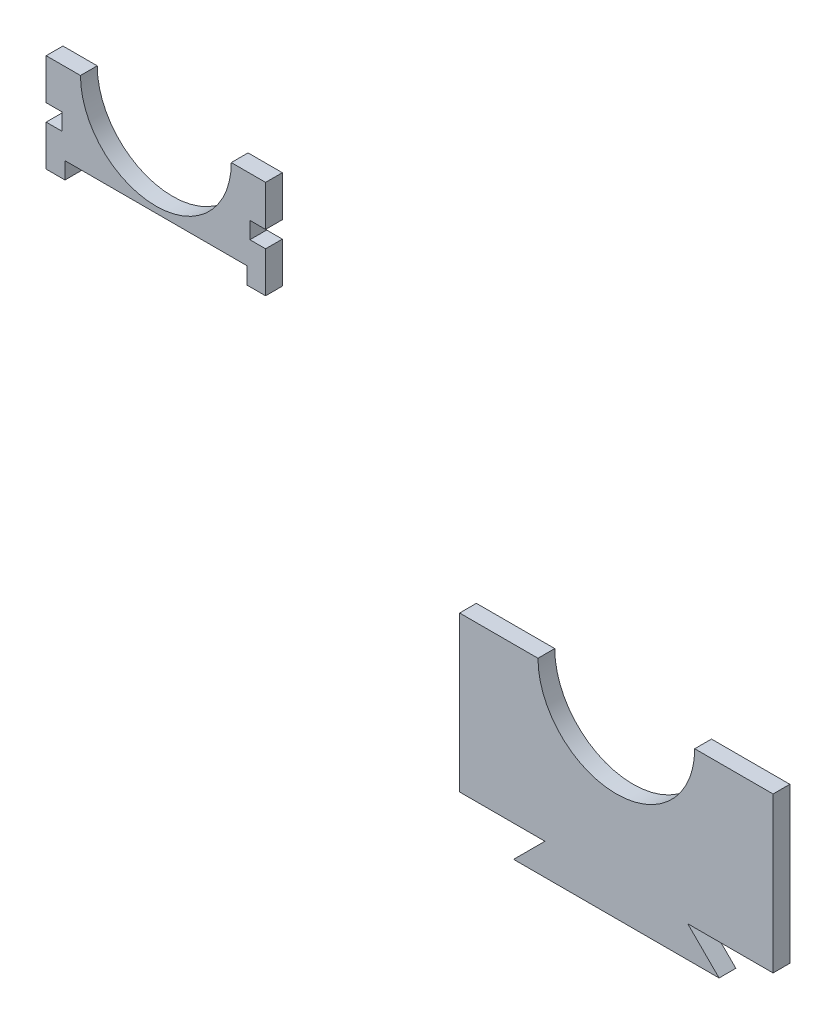
ISO-10303-21;
HEADER;
FILE_DESCRIPTION(('STEP AP214'),'2;1');
FILE_NAME('part.step','',(''),(''),'','','');
FILE_SCHEMA(('AUTOMOTIVE_DESIGN { 1 0 10303 214 1 1 1 1 }'));
ENDSEC;
DATA;
#1=APPLICATION_CONTEXT('core data for automotive mechanical design processes');
#2=APPLICATION_PROTOCOL_DEFINITION('international standard','automotive_design',2000,#1);
#3=PRODUCT_CONTEXT('',#1,'mechanical');
#4=PRODUCT('Part','Part','',(#3));
#5=PRODUCT_RELATED_PRODUCT_CATEGORY('part','',(#4));
#6=PRODUCT_DEFINITION_FORMATION('','',#4);
#7=PRODUCT_DEFINITION_CONTEXT('part definition',#1,'design');
#8=PRODUCT_DEFINITION('design','',#6,#7);
#9=PRODUCT_DEFINITION_SHAPE('','',#8);
#10=(LENGTH_UNIT() NAMED_UNIT(*) SI_UNIT(.MILLI.,.METRE.));
#11=(NAMED_UNIT(*) PLANE_ANGLE_UNIT() SI_UNIT($,.RADIAN.));
#12=(NAMED_UNIT(*) SI_UNIT($,.STERADIAN.) SOLID_ANGLE_UNIT());
#13=UNCERTAINTY_MEASURE_WITH_UNIT(LENGTH_MEASURE(1.E-05),#10,'distance_accuracy_value','');
#14=(GEOMETRIC_REPRESENTATION_CONTEXT(3) GLOBAL_UNCERTAINTY_ASSIGNED_CONTEXT((#13)) GLOBAL_UNIT_ASSIGNED_CONTEXT((#10,
#11,#12)) REPRESENTATION_CONTEXT('',''));
#15=CARTESIAN_POINT('',(0.,0.,0.));
#16=DIRECTION('',(0.,0.,1.));
#17=DIRECTION('',(1.,0.,0.));
#18=AXIS2_PLACEMENT_3D('',#15,#16,#17);
#19=CARTESIAN_POINT('',(114.119509818811,-121.477215278298,5.35));
#20=DIRECTION('',(0.707106781186551,-0.707106781186544,0.));
#21=DIRECTION('',(0.707106781186544,0.707106781186551,0.));
#22=AXIS2_PLACEMENT_3D('',#19,#20,#21);
#23=PLANE('',#22);
#24=DIRECTION('',(-0.707106781186544,-0.707106781186551,0.));
#25=VECTOR('',#24,1.);
#26=CARTESIAN_POINT('',(114.119509818811,-121.477215278298,0.));
#27=LINE('',#26,#25);
#28=CARTESIAN_POINT('',(124.119509818811,-111.477215278298,0.));
#29=VERTEX_POINT('',#28);
#30=CARTESIAN_POINT('',(114.119509818811,-121.477215278298,0.));
#31=VERTEX_POINT('',#30);
#32=EDGE_CURVE('E151',#29,#31,#27,.T.);
#33=ORIENTED_EDGE('',*,*,#32,.T.);
#34=DIRECTION('',(0.,0.,-1.));
#35=VECTOR('',#34,1.);
#36=CARTESIAN_POINT('',(114.119509818811,-121.477215278298,5.35));
#37=LINE('',#36,#35);
#38=CARTESIAN_POINT('',(114.119509818811,-121.477215278298,5.35));
#39=VERTEX_POINT('',#38);
#40=EDGE_CURVE('E12',#39,#31,#37,.T.);
#41=ORIENTED_EDGE('',*,*,#40,.F.);
#42=DIRECTION('',(-0.707106781186544,-0.707106781186551,0.));
#43=VECTOR('',#42,1.);
#44=CARTESIAN_POINT('',(114.119509818811,-121.477215278298,5.35));
#45=LINE('',#44,#43);
#46=CARTESIAN_POINT('',(124.119509818811,-111.477215278298,5.35));
#47=VERTEX_POINT('',#46);
#48=EDGE_CURVE('E169',#47,#39,#45,.T.);
#49=ORIENTED_EDGE('',*,*,#48,.F.);
#50=DIRECTION('',(0.,0.,-1.));
#51=VECTOR('',#50,1.);
#52=CARTESIAN_POINT('',(124.119509818811,-111.477215278298,5.35));
#53=LINE('',#52,#51);
#54=EDGE_CURVE('E147',#47,#29,#53,.T.);
#55=ORIENTED_EDGE('',*,*,#54,.T.);
#56=EDGE_LOOP('',(#33,#41,#49,#55));
#57=FACE_BOUND('',#56,.T.);
#58=ADVANCED_FACE('F43',(#57),#23,.F.);
#59=CARTESIAN_POINT('',(114.119509818811,-121.477215278298,5.35));
#60=DIRECTION('',(0.,1.,0.));
#61=DIRECTION('',(0.,0.,1.));
#62=AXIS2_PLACEMENT_3D('',#59,#60,#61);
#63=PLANE('',#62);
#64=DIRECTION('',(1.,0.,0.));
#65=VECTOR('',#64,1.);
#66=CARTESIAN_POINT('',(114.119509818811,-121.477215278298,0.));
#67=LINE('',#66,#65);
#68=CARTESIAN_POINT('',(179.674785827473,-121.477215278298,0.));
#69=VERTEX_POINT('',#68);
#70=EDGE_CURVE('E154',#31,#69,#67,.T.);
#71=ORIENTED_EDGE('',*,*,#70,.T.);
#72=DIRECTION('',(0.,0.,-1.));
#73=VECTOR('',#72,1.);
#74=CARTESIAN_POINT('',(179.674785827473,-121.477215278298,5.35));
#75=LINE('',#74,#73);
#76=CARTESIAN_POINT('',(179.674785827473,-121.477215278298,5.35));
#77=VERTEX_POINT('',#76);
#78=EDGE_CURVE('E51',#77,#69,#75,.T.);
#79=ORIENTED_EDGE('',*,*,#78,.F.);
#80=DIRECTION('',(1.,0.,0.));
#81=VECTOR('',#80,1.);
#82=CARTESIAN_POINT('',(114.119509818811,-121.477215278298,5.35));
#83=LINE('',#82,#81);
#84=EDGE_CURVE('E108',#39,#77,#83,.T.);
#85=ORIENTED_EDGE('',*,*,#84,.F.);
#86=ORIENTED_EDGE('',*,*,#40,.T.);
#87=EDGE_LOOP('',(#71,#79,#85,#86));
#88=FACE_BOUND('',#87,.T.);
#89=ADVANCED_FACE('F218',(#88),#63,.F.);
#90=CARTESIAN_POINT('',(179.674785827473,-121.477215278298,5.35));
#91=DIRECTION('',(-0.707106781186549,-0.707106781186546,0.));
#92=DIRECTION('',(0.707106781186546,-0.707106781186549,0.));
#93=AXIS2_PLACEMENT_3D('',#90,#91,#92);
#94=PLANE('',#93);
#95=DIRECTION('',(-0.707106781186546,0.707106781186549,0.));
#96=VECTOR('',#95,1.);
#97=CARTESIAN_POINT('',(179.674785827473,-121.477215278298,0.));
#98=LINE('',#97,#96);
#99=CARTESIAN_POINT('',(169.674785827473,-111.477215278298,0.));
#100=VERTEX_POINT('',#99);
#101=EDGE_CURVE('E156',#69,#100,#98,.T.);
#102=ORIENTED_EDGE('',*,*,#101,.T.);
#103=DIRECTION('',(0.,0.,-1.));
#104=VECTOR('',#103,1.);
#105=CARTESIAN_POINT('',(169.674785827473,-111.477215278298,5.35));
#106=LINE('',#105,#104);
#107=CARTESIAN_POINT('',(169.674785827473,-111.477215278298,5.35));
#108=VERTEX_POINT('',#107);
#109=EDGE_CURVE('E182',#108,#100,#106,.T.);
#110=ORIENTED_EDGE('',*,*,#109,.F.);
#111=DIRECTION('',(-0.707106781186546,0.707106781186549,0.));
#112=VECTOR('',#111,1.);
#113=CARTESIAN_POINT('',(179.674785827473,-121.477215278298,5.35));
#114=LINE('',#113,#112);
#115=EDGE_CURVE('E190',#77,#108,#114,.T.);
#116=ORIENTED_EDGE('',*,*,#115,.F.);
#117=ORIENTED_EDGE('',*,*,#78,.T.);
#118=EDGE_LOOP('',(#102,#110,#116,#117));
#119=FACE_BOUND('',#118,.T.);
#120=ADVANCED_FACE('F188',(#119),#94,.F.);
#121=CARTESIAN_POINT('',(169.674785827473,-111.477215278298,5.35));
#122=DIRECTION('',(0.,1.,0.));
#123=DIRECTION('',(0.,0.,1.));
#124=AXIS2_PLACEMENT_3D('',#121,#122,#123);
#125=PLANE('',#124);
#126=DIRECTION('',(1.,0.,0.));
#127=VECTOR('',#126,1.);
#128=CARTESIAN_POINT('',(169.674785827473,-111.477215278298,0.));
#129=LINE('',#128,#127);
#130=CARTESIAN_POINT('',(196.897147823142,-111.477215278298,0.));
#131=VERTEX_POINT('',#130);
#132=EDGE_CURVE('E158',#100,#131,#129,.T.);
#133=ORIENTED_EDGE('',*,*,#132,.T.);
#134=DIRECTION('',(0.,0.,-1.));
#135=VECTOR('',#134,1.);
#136=CARTESIAN_POINT('',(196.897147823142,-111.477215278298,5.35));
#137=LINE('',#136,#135);
#138=CARTESIAN_POINT('',(196.897147823142,-111.477215278298,5.35));
#139=VERTEX_POINT('',#138);
#140=EDGE_CURVE('E179',#139,#131,#137,.T.);
#141=ORIENTED_EDGE('',*,*,#140,.F.);
#142=DIRECTION('',(1.,0.,0.));
#143=VECTOR('',#142,1.);
#144=CARTESIAN_POINT('',(169.674785827473,-111.477215278298,5.35));
#145=LINE('',#144,#143);
#146=EDGE_CURVE('E208',#108,#139,#145,.T.);
#147=ORIENTED_EDGE('',*,*,#146,.F.);
#148=ORIENTED_EDGE('',*,*,#109,.T.);
#149=EDGE_LOOP('',(#133,#141,#147,#148));
#150=FACE_BOUND('',#149,.T.);
#151=ADVANCED_FACE('F199',(#150),#125,.F.);
#152=CARTESIAN_POINT('',(196.897147823142,-111.477215278298,5.35));
#153=DIRECTION('',(-1.,0.,0.));
#154=DIRECTION('',(0.,0.,1.));
#155=AXIS2_PLACEMENT_3D('',#152,#153,#154);
#156=PLANE('',#155);
#157=DIRECTION('',(0.,1.,0.));
#158=VECTOR('',#157,1.);
#159=CARTESIAN_POINT('',(196.897147823142,-111.477215278298,0.));
#160=LINE('',#159,#158);
#161=CARTESIAN_POINT('',(196.897147823142,-62.0226927100301,0.));
#162=VERTEX_POINT('',#161);
#163=EDGE_CURVE('E160',#131,#162,#160,.T.);
#164=ORIENTED_EDGE('',*,*,#163,.T.);
#165=DIRECTION('',(0.,0.,-1.));
#166=VECTOR('',#165,1.);
#167=CARTESIAN_POINT('',(196.897147823142,-62.0226927100301,5.35));
#168=LINE('',#167,#166);
#169=CARTESIAN_POINT('',(196.897147823142,-62.0226927100301,5.35));
#170=VERTEX_POINT('',#169);
#171=EDGE_CURVE('E176',#170,#162,#168,.T.);
#172=ORIENTED_EDGE('',*,*,#171,.F.);
#173=DIRECTION('',(0.,1.,0.));
#174=VECTOR('',#173,1.);
#175=CARTESIAN_POINT('',(196.897147823142,-111.477215278298,5.35));
#176=LINE('',#175,#174);
#177=EDGE_CURVE('E205',#139,#170,#176,.T.);
#178=ORIENTED_EDGE('',*,*,#177,.F.);
#179=ORIENTED_EDGE('',*,*,#140,.T.);
#180=EDGE_LOOP('',(#164,#172,#178,#179));
#181=FACE_BOUND('',#180,.T.);
#182=ADVANCED_FACE('F203',(#181),#156,.F.);
#183=CARTESIAN_POINT('',(171.897147823142,-62.0226927100301,5.35));
#184=DIRECTION('',(0.,-1.,0.));
#185=DIRECTION('',(0.,0.,-1.));
#186=AXIS2_PLACEMENT_3D('',#183,#184,#185);
#187=PLANE('',#186);
#188=DIRECTION('',(-1.,0.,0.));
#189=VECTOR('',#188,1.);
#190=CARTESIAN_POINT('',(171.897147823142,-62.0226927100301,0.));
#191=LINE('',#190,#189);
#192=CARTESIAN_POINT('',(171.897147823142,-62.0226927100301,0.));
#193=VERTEX_POINT('',#192);
#194=EDGE_CURVE('E162',#162,#193,#191,.T.);
#195=ORIENTED_EDGE('',*,*,#194,.T.);
#196=DIRECTION('',(0.,0.,-1.));
#197=VECTOR('',#196,1.);
#198=CARTESIAN_POINT('',(171.897147823142,-62.0226927100301,5.35));
#199=LINE('',#198,#197);
#200=CARTESIAN_POINT('',(171.897147823142,-62.0226927100301,5.35));
#201=VERTEX_POINT('',#200);
#202=EDGE_CURVE('E173',#201,#193,#199,.T.);
#203=ORIENTED_EDGE('',*,*,#202,.F.);
#204=DIRECTION('',(-1.,0.,0.));
#205=VECTOR('',#204,1.);
#206=CARTESIAN_POINT('',(171.897147823142,-62.0226927100301,5.35));
#207=LINE('',#206,#205);
#208=EDGE_CURVE('E207',#170,#201,#207,.T.);
#209=ORIENTED_EDGE('',*,*,#208,.F.);
#210=ORIENTED_EDGE('',*,*,#171,.T.);
#211=EDGE_LOOP('',(#195,#203,#209,#210));
#212=FACE_BOUND('',#211,.T.);
#213=ADVANCED_FACE('F230',(#212),#187,.F.);
#214=CARTESIAN_POINT('',(146.897147823142,-62.0226927100301,5.35));
#215=DIRECTION('',(0.,0.,-1.));
#216=DIRECTION('',(-1.,0.,0.));
#217=AXIS2_PLACEMENT_3D('',#214,#215,#216);
#218=CYLINDRICAL_SURFACE('',#217,25.);
#219=CARTESIAN_POINT('',(146.897147823142,-62.0226927100301,0.));
#220=DIRECTION('',(0.,0.,-1.));
#221=DIRECTION('',(1.,0.,0.));
#222=AXIS2_PLACEMENT_3D('',#219,#220,#221);
#223=CIRCLE('',#222,25.);
#224=CARTESIAN_POINT('',(121.897147823142,-62.0226927100301,0.));
#225=VERTEX_POINT('',#224);
#226=EDGE_CURVE('E164',#193,#225,#223,.T.);
#227=ORIENTED_EDGE('',*,*,#226,.T.);
#228=DIRECTION('',(0.,0.,-1.));
#229=VECTOR('',#228,1.);
#230=CARTESIAN_POINT('',(121.897147823142,-62.0226927100301,5.35));
#231=LINE('',#230,#229);
#232=CARTESIAN_POINT('',(121.897147823142,-62.0226927100301,5.35));
#233=VERTEX_POINT('',#232);
#234=EDGE_CURVE('E142',#233,#225,#231,.T.);
#235=ORIENTED_EDGE('',*,*,#234,.F.);
#236=CARTESIAN_POINT('',(146.897147823142,-62.0226927100301,5.35));
#237=DIRECTION('',(0.,0.,-1.));
#238=DIRECTION('',(1.,0.,0.));
#239=AXIS2_PLACEMENT_3D('',#236,#237,#238);
#240=CIRCLE('',#239,25.);
#241=EDGE_CURVE('E133',#201,#233,#240,.T.);
#242=ORIENTED_EDGE('',*,*,#241,.F.);
#243=ORIENTED_EDGE('',*,*,#202,.T.);
#244=EDGE_LOOP('',(#227,#235,#242,#243));
#245=FACE_BOUND('',#244,.T.);
#246=ADVANCED_FACE('F233',(#245),#218,.F.);
#247=CARTESIAN_POINT('',(96.897147823142,-62.0226927100301,5.35));
#248=DIRECTION('',(0.,-1.,0.));
#249=DIRECTION('',(0.,0.,-1.));
#250=AXIS2_PLACEMENT_3D('',#247,#248,#249);
#251=PLANE('',#250);
#252=DIRECTION('',(-1.,0.,0.));
#253=VECTOR('',#252,1.);
#254=CARTESIAN_POINT('',(96.897147823142,-62.0226927100301,0.));
#255=LINE('',#254,#253);
#256=CARTESIAN_POINT('',(96.897147823142,-62.0226927100301,0.));
#257=VERTEX_POINT('',#256);
#258=EDGE_CURVE('E141',#225,#257,#255,.T.);
#259=ORIENTED_EDGE('',*,*,#258,.T.);
#260=DIRECTION('',(0.,0.,-1.));
#261=VECTOR('',#260,1.);
#262=CARTESIAN_POINT('',(96.897147823142,-62.0226927100301,5.35));
#263=LINE('',#262,#261);
#264=CARTESIAN_POINT('',(96.897147823142,-62.0226927100301,5.35));
#265=VERTEX_POINT('',#264);
#266=EDGE_CURVE('E138',#265,#257,#263,.T.);
#267=ORIENTED_EDGE('',*,*,#266,.F.);
#268=DIRECTION('',(-1.,0.,0.));
#269=VECTOR('',#268,1.);
#270=CARTESIAN_POINT('',(96.897147823142,-62.0226927100301,5.35));
#271=LINE('',#270,#269);
#272=EDGE_CURVE('E127',#233,#265,#271,.T.);
#273=ORIENTED_EDGE('',*,*,#272,.F.);
#274=ORIENTED_EDGE('',*,*,#234,.T.);
#275=EDGE_LOOP('',(#259,#267,#273,#274));
#276=FACE_BOUND('',#275,.T.);
#277=ADVANCED_FACE('F139',(#276),#251,.F.);
#278=CARTESIAN_POINT('',(96.897147823142,-111.477215278298,5.35));
#279=DIRECTION('',(1.,0.,0.));
#280=DIRECTION('',(0.,0.,-1.));
#281=AXIS2_PLACEMENT_3D('',#278,#279,#280);
#282=PLANE('',#281);
#283=DIRECTION('',(0.,-1.,0.));
#284=VECTOR('',#283,1.);
#285=CARTESIAN_POINT('',(96.897147823142,-111.477215278298,0.));
#286=LINE('',#285,#284);
#287=CARTESIAN_POINT('',(96.897147823142,-111.477215278298,0.));
#288=VERTEX_POINT('',#287);
#289=EDGE_CURVE('E94',#257,#288,#286,.T.);
#290=ORIENTED_EDGE('',*,*,#289,.T.);
#291=DIRECTION('',(0.,0.,-1.));
#292=VECTOR('',#291,1.);
#293=CARTESIAN_POINT('',(96.897147823142,-111.477215278298,5.35));
#294=LINE('',#293,#292);
#295=CARTESIAN_POINT('',(96.897147823142,-111.477215278298,5.35));
#296=VERTEX_POINT('',#295);
#297=EDGE_CURVE('E143',#296,#288,#294,.T.);
#298=ORIENTED_EDGE('',*,*,#297,.F.);
#299=DIRECTION('',(0.,-1.,0.));
#300=VECTOR('',#299,1.);
#301=CARTESIAN_POINT('',(96.897147823142,-111.477215278298,5.35));
#302=LINE('',#301,#300);
#303=EDGE_CURVE('E131',#265,#296,#302,.T.);
#304=ORIENTED_EDGE('',*,*,#303,.F.);
#305=ORIENTED_EDGE('',*,*,#266,.T.);
#306=EDGE_LOOP('',(#290,#298,#304,#305));
#307=FACE_BOUND('',#306,.T.);
#308=ADVANCED_FACE('F145',(#307),#282,.F.);
#309=CARTESIAN_POINT('',(96.897147823142,-111.477215278298,5.35));
#310=DIRECTION('',(0.,1.,0.));
#311=DIRECTION('',(0.,0.,1.));
#312=AXIS2_PLACEMENT_3D('',#309,#310,#311);
#313=PLANE('',#312);
#314=DIRECTION('',(1.,0.,0.));
#315=VECTOR('',#314,1.);
#316=CARTESIAN_POINT('',(96.897147823142,-111.477215278298,0.));
#317=LINE('',#316,#315);
#318=EDGE_CURVE('E100',#288,#29,#317,.T.);
#319=ORIENTED_EDGE('',*,*,#318,.T.);
#320=ORIENTED_EDGE('',*,*,#54,.F.);
#321=DIRECTION('',(1.,0.,0.));
#322=VECTOR('',#321,1.);
#323=CARTESIAN_POINT('',(96.897147823142,-111.477215278298,5.35));
#324=LINE('',#323,#322);
#325=EDGE_CURVE('E59',#296,#47,#324,.T.);
#326=ORIENTED_EDGE('',*,*,#325,.F.);
#327=ORIENTED_EDGE('',*,*,#297,.T.);
#328=EDGE_LOOP('',(#319,#320,#326,#327));
#329=FACE_BOUND('',#328,.T.);
#330=ADVANCED_FACE('F242',(#329),#313,.F.);
#331=CARTESIAN_POINT('',(146.897147823142,-62.0226927100301,5.35));
#332=DIRECTION('',(0.,0.,1.));
#333=DIRECTION('',(1.,0.,0.));
#334=AXIS2_PLACEMENT_3D('',#331,#332,#333);
#335=PLANE('',#334);
#336=ORIENTED_EDGE('',*,*,#48,.T.);
#337=ORIENTED_EDGE('',*,*,#84,.T.);
#338=ORIENTED_EDGE('',*,*,#115,.T.);
#339=ORIENTED_EDGE('',*,*,#146,.T.);
#340=ORIENTED_EDGE('',*,*,#177,.T.);
#341=ORIENTED_EDGE('',*,*,#208,.T.);
#342=ORIENTED_EDGE('',*,*,#241,.T.);
#343=ORIENTED_EDGE('',*,*,#272,.T.);
#344=ORIENTED_EDGE('',*,*,#303,.T.);
#345=ORIENTED_EDGE('',*,*,#325,.T.);
#346=EDGE_LOOP('',(#336,#337,#338,#339,#340,#341,#342,#343,#344,#345));
#347=FACE_BOUND('',#346,.T.);
#348=ADVANCED_FACE('F129',(#347),#335,.T.);
#349=CARTESIAN_POINT('',(146.897147823142,-62.0226927100301,0.));
#350=DIRECTION('',(0.,0.,1.));
#351=DIRECTION('',(1.,0.,0.));
#352=AXIS2_PLACEMENT_3D('',#349,#350,#351);
#353=PLANE('',#352);
#354=ORIENTED_EDGE('',*,*,#32,.F.);
#355=ORIENTED_EDGE('',*,*,#318,.F.);
#356=ORIENTED_EDGE('',*,*,#289,.F.);
#357=ORIENTED_EDGE('',*,*,#258,.F.);
#358=ORIENTED_EDGE('',*,*,#226,.F.);
#359=ORIENTED_EDGE('',*,*,#194,.F.);
#360=ORIENTED_EDGE('',*,*,#163,.F.);
#361=ORIENTED_EDGE('',*,*,#132,.F.);
#362=ORIENTED_EDGE('',*,*,#101,.F.);
#363=ORIENTED_EDGE('',*,*,#70,.F.);
#364=EDGE_LOOP('',(#354,#355,#356,#357,#358,#359,#360,#361,#362,#363));
#365=FACE_BOUND('',#364,.T.);
#366=ADVANCED_FACE('F194',(#365),#353,.F.);
#367=CLOSED_SHELL('',(#58,#89,#120,#151,#182,#213,#246,#277,#308,#330,#348,#366));
#368=MANIFOLD_SOLID_BREP('B2',#367);
#369=CARTESIAN_POINT('',(-35.,-5.35,5.35));
#370=DIRECTION('',(0.,1.,0.));
#371=DIRECTION('',(-1.,0.,0.));
#372=AXIS2_PLACEMENT_3D('',#369,#370,#371);
#373=PLANE('',#372);
#374=DIRECTION('',(1.,0.,0.));
#375=VECTOR('',#374,1.);
#376=CARTESIAN_POINT('',(-35.,-5.35,0.));
#377=LINE('',#376,#375);
#378=CARTESIAN_POINT('',(-35.,-5.35,0.));
#379=VERTEX_POINT('',#378);
#380=CARTESIAN_POINT('',(-29.,-5.35,0.));
#381=VERTEX_POINT('',#380);
#382=EDGE_CURVE('E483',#379,#381,#377,.T.);
#383=ORIENTED_EDGE('',*,*,#382,.T.);
#384=DIRECTION('',(0.,0.,-1.));
#385=VECTOR('',#384,1.);
#386=CARTESIAN_POINT('',(-29.,-5.35,5.35));
#387=LINE('',#386,#385);
#388=CARTESIAN_POINT('',(-29.,-5.35,5.35));
#389=VERTEX_POINT('',#388);
#390=EDGE_CURVE('E331',#389,#381,#387,.T.);
#391=ORIENTED_EDGE('',*,*,#390,.F.);
#392=DIRECTION('',(1.,0.,0.));
#393=VECTOR('',#392,1.);
#394=CARTESIAN_POINT('',(-35.,-5.35,5.35));
#395=LINE('',#394,#393);
#396=CARTESIAN_POINT('',(-35.,-5.35,5.35));
#397=VERTEX_POINT('',#396);
#398=EDGE_CURVE('E413',#397,#389,#395,.T.);
#399=ORIENTED_EDGE('',*,*,#398,.F.);
#400=DIRECTION('',(0.,0.,-1.));
#401=VECTOR('',#400,1.);
#402=CARTESIAN_POINT('',(-35.,-5.35,5.35));
#403=LINE('',#402,#401);
#404=EDGE_CURVE('E41',#397,#379,#403,.T.);
#405=ORIENTED_EDGE('',*,*,#404,.T.);
#406=EDGE_LOOP('',(#383,#391,#399,#405));
#407=FACE_BOUND('',#406,.T.);
#408=ADVANCED_FACE('F323',(#407),#373,.F.);
#409=CARTESIAN_POINT('',(-29.,0.,5.35));
#410=DIRECTION('',(-1.,0.,0.));
#411=DIRECTION('',(0.,0.,1.));
#412=AXIS2_PLACEMENT_3D('',#409,#410,#411);
#413=PLANE('',#412);
#414=DIRECTION('',(0.,1.,0.));
#415=VECTOR('',#414,1.);
#416=CARTESIAN_POINT('',(-29.,0.,0.));
#417=LINE('',#416,#415);
#418=CARTESIAN_POINT('',(-29.,0.,0.));
#419=VERTEX_POINT('',#418);
#420=EDGE_CURVE('E485',#381,#419,#417,.T.);
#421=ORIENTED_EDGE('',*,*,#420,.T.);
#422=DIRECTION('',(0.,0.,-1.));
#423=VECTOR('',#422,1.);
#424=CARTESIAN_POINT('',(-29.,0.,5.35));
#425=LINE('',#424,#423);
#426=CARTESIAN_POINT('',(-29.,0.,5.35));
#427=VERTEX_POINT('',#426);
#428=EDGE_CURVE('E553',#427,#419,#425,.T.);
#429=ORIENTED_EDGE('',*,*,#428,.F.);
#430=DIRECTION('',(0.,1.,0.));
#431=VECTOR('',#430,1.);
#432=CARTESIAN_POINT('',(-29.,0.,5.35));
#433=LINE('',#432,#431);
#434=EDGE_CURVE('E561',#389,#427,#433,.T.);
#435=ORIENTED_EDGE('',*,*,#434,.F.);
#436=ORIENTED_EDGE('',*,*,#390,.T.);
#437=EDGE_LOOP('',(#421,#429,#435,#436));
#438=FACE_BOUND('',#437,.T.);
#439=ADVANCED_FACE('F559',(#438),#413,.F.);
#440=CARTESIAN_POINT('',(-29.,0.,5.35));
#441=DIRECTION('',(0.,1.,0.));
#442=DIRECTION('',(0.,0.,1.));
#443=AXIS2_PLACEMENT_3D('',#440,#441,#442);
#444=PLANE('',#443);
#445=DIRECTION('',(1.,0.,0.));
#446=VECTOR('',#445,1.);
#447=CARTESIAN_POINT('',(-29.,0.,0.));
#448=LINE('',#447,#446);
#449=CARTESIAN_POINT('',(29.,0.,0.));
#450=VERTEX_POINT('',#449);
#451=EDGE_CURVE('E487',#419,#450,#448,.T.);
#452=ORIENTED_EDGE('',*,*,#451,.T.);
#453=DIRECTION('',(0.,0.,-1.));
#454=VECTOR('',#453,1.);
#455=CARTESIAN_POINT('',(29.,0.,5.35));
#456=LINE('',#455,#454);
#457=CARTESIAN_POINT('',(29.,0.,5.35));
#458=VERTEX_POINT('',#457);
#459=EDGE_CURVE('E550',#458,#450,#456,.T.);
#460=ORIENTED_EDGE('',*,*,#459,.F.);
#461=DIRECTION('',(1.,0.,0.));
#462=VECTOR('',#461,1.);
#463=CARTESIAN_POINT('',(-29.,0.,5.35));
#464=LINE('',#463,#462);
#465=EDGE_CURVE('E580',#427,#458,#464,.T.);
#466=ORIENTED_EDGE('',*,*,#465,.F.);
#467=ORIENTED_EDGE('',*,*,#428,.T.);
#468=EDGE_LOOP('',(#452,#460,#466,#467));
#469=FACE_BOUND('',#468,.T.);
#470=ADVANCED_FACE('F571',(#469),#444,.F.);
#471=CARTESIAN_POINT('',(29.,0.,5.35));
#472=DIRECTION('',(1.,0.,0.));
#473=DIRECTION('',(0.,1.,0.));
#474=AXIS2_PLACEMENT_3D('',#471,#472,#473);
#475=PLANE('',#474);
#476=DIRECTION('',(0.,-1.,0.));
#477=VECTOR('',#476,1.);
#478=CARTESIAN_POINT('',(29.,0.,0.));
#479=LINE('',#478,#477);
#480=CARTESIAN_POINT('',(29.,-5.35,0.));
#481=VERTEX_POINT('',#480);
#482=EDGE_CURVE('E489',#450,#481,#479,.T.);
#483=ORIENTED_EDGE('',*,*,#482,.T.);
#484=DIRECTION('',(0.,0.,-1.));
#485=VECTOR('',#484,1.);
#486=CARTESIAN_POINT('',(29.,-5.35,5.35));
#487=LINE('',#486,#485);
#488=CARTESIAN_POINT('',(29.,-5.35,5.35));
#489=VERTEX_POINT('',#488);
#490=EDGE_CURVE('E547',#489,#481,#487,.T.);
#491=ORIENTED_EDGE('',*,*,#490,.F.);
#492=DIRECTION('',(0.,-1.,0.));
#493=VECTOR('',#492,1.);
#494=CARTESIAN_POINT('',(29.,0.,5.35));
#495=LINE('',#494,#493);
#496=EDGE_CURVE('E577',#458,#489,#495,.T.);
#497=ORIENTED_EDGE('',*,*,#496,.F.);
#498=ORIENTED_EDGE('',*,*,#459,.T.);
#499=EDGE_LOOP('',(#483,#491,#497,#498));
#500=FACE_BOUND('',#499,.T.);
#501=ADVANCED_FACE('F575',(#500),#475,.F.);
#502=CARTESIAN_POINT('',(35.,-5.35,5.35));
#503=DIRECTION('',(0.,1.,0.));
#504=DIRECTION('',(0.,0.,1.));
#505=AXIS2_PLACEMENT_3D('',#502,#503,#504);
#506=PLANE('',#505);
#507=DIRECTION('',(1.,0.,0.));
#508=VECTOR('',#507,1.);
#509=CARTESIAN_POINT('',(35.,-5.35,0.));
#510=LINE('',#509,#508);
#511=CARTESIAN_POINT('',(35.,-5.35,0.));
#512=VERTEX_POINT('',#511);
#513=EDGE_CURVE('E491',#481,#512,#510,.T.);
#514=ORIENTED_EDGE('',*,*,#513,.T.);
#515=DIRECTION('',(0.,0.,-1.));
#516=VECTOR('',#515,1.);
#517=CARTESIAN_POINT('',(35.,-5.35,5.35));
#518=LINE('',#517,#516);
#519=CARTESIAN_POINT('',(35.,-5.35,5.35));
#520=VERTEX_POINT('',#519);
#521=EDGE_CURVE('E544',#520,#512,#518,.T.);
#522=ORIENTED_EDGE('',*,*,#521,.F.);
#523=DIRECTION('',(1.,0.,0.));
#524=VECTOR('',#523,1.);
#525=CARTESIAN_POINT('',(35.,-5.35,5.35));
#526=LINE('',#525,#524);
#527=EDGE_CURVE('E579',#489,#520,#526,.T.);
#528=ORIENTED_EDGE('',*,*,#527,.F.);
#529=ORIENTED_EDGE('',*,*,#490,.T.);
#530=EDGE_LOOP('',(#514,#522,#528,#529));
#531=FACE_BOUND('',#530,.T.);
#532=ADVANCED_FACE('F634',(#531),#506,.F.);
#533=CARTESIAN_POINT('',(35.,-5.31754230471196,5.35));
#534=DIRECTION('',(-1.,0.,0.));
#535=DIRECTION('',(0.,-1.,0.));
#536=AXIS2_PLACEMENT_3D('',#533,#534,#535);
#537=PLANE('',#536);
#538=DIRECTION('',(0.,1.,0.));
#539=VECTOR('',#538,1.);
#540=CARTESIAN_POINT('',(35.,-5.31754230471196,0.));
#541=LINE('',#540,#539);
#542=CARTESIAN_POINT('',(35.,7.65,0.));
#543=VERTEX_POINT('',#542);
#544=EDGE_CURVE('E494',#512,#543,#541,.T.);
#545=ORIENTED_EDGE('',*,*,#544,.T.);
#546=DIRECTION('',(0.,0.,-1.));
#547=VECTOR('',#546,1.);
#548=CARTESIAN_POINT('',(35.,7.65,5.35));
#549=LINE('',#548,#547);
#550=CARTESIAN_POINT('',(35.,7.65,5.35));
#551=VERTEX_POINT('',#550);
#552=EDGE_CURVE('E541',#551,#543,#549,.T.);
#553=ORIENTED_EDGE('',*,*,#552,.F.);
#554=DIRECTION('',(-4.27565410441507E-13,1.,0.));
#555=VECTOR('',#554,1.);
#556=CARTESIAN_POINT('',(35.,-5.31754230471196,5.35));
#557=LINE('',#556,#555);
#558=EDGE_CURVE('E582',#520,#551,#557,.T.);
#559=ORIENTED_EDGE('',*,*,#558,.F.);
#560=ORIENTED_EDGE('',*,*,#521,.T.);
#561=EDGE_LOOP('',(#545,#553,#559,#560));
#562=FACE_BOUND('',#561,.T.);
#563=ADVANCED_FACE('F637',(#562),#537,.F.);
#564=CARTESIAN_POINT('',(35.,7.65,5.35));
#565=DIRECTION('',(0.,-1.,0.));
#566=DIRECTION('',(0.,0.,-1.));
#567=AXIS2_PLACEMENT_3D('',#564,#565,#566);
#568=PLANE('',#567);
#569=DIRECTION('',(-1.,0.,0.));
#570=VECTOR('',#569,1.);
#571=CARTESIAN_POINT('',(35.,7.65,0.));
#572=LINE('',#571,#570);
#573=CARTESIAN_POINT('',(30.,7.65,0.));
#574=VERTEX_POINT('',#573);
#575=EDGE_CURVE('E496',#543,#574,#572,.T.);
#576=ORIENTED_EDGE('',*,*,#575,.T.);
#577=DIRECTION('',(0.,0.,-1.));
#578=VECTOR('',#577,1.);
#579=CARTESIAN_POINT('',(30.,7.65,5.35));
#580=LINE('',#579,#578);
#581=CARTESIAN_POINT('',(30.,7.65,5.35));
#582=VERTEX_POINT('',#581);
#583=EDGE_CURVE('E538',#582,#574,#580,.T.);
#584=ORIENTED_EDGE('',*,*,#583,.F.);
#585=DIRECTION('',(-1.,0.,0.));
#586=VECTOR('',#585,1.);
#587=CARTESIAN_POINT('',(35.,7.65,5.35));
#588=LINE('',#587,#586);
#589=EDGE_CURVE('E588',#551,#582,#588,.T.);
#590=ORIENTED_EDGE('',*,*,#589,.F.);
#591=ORIENTED_EDGE('',*,*,#552,.T.);
#592=EDGE_LOOP('',(#576,#584,#590,#591));
#593=FACE_BOUND('',#592,.T.);
#594=ADVANCED_FACE('F641',(#593),#568,.F.);
#595=CARTESIAN_POINT('',(30.,13.,5.35));
#596=DIRECTION('',(-1.,0.,0.));
#597=DIRECTION('',(0.,0.,1.));
#598=AXIS2_PLACEMENT_3D('',#595,#596,#597);
#599=PLANE('',#598);
#600=DIRECTION('',(0.,1.,0.));
#601=VECTOR('',#600,1.);
#602=CARTESIAN_POINT('',(30.,13.,0.));
#603=LINE('',#602,#601);
#604=CARTESIAN_POINT('',(30.,13.,0.));
#605=VERTEX_POINT('',#604);
#606=EDGE_CURVE('E498',#574,#605,#603,.T.);
#607=ORIENTED_EDGE('',*,*,#606,.T.);
#608=DIRECTION('',(0.,0.,-1.));
#609=VECTOR('',#608,1.);
#610=CARTESIAN_POINT('',(30.,13.,5.35));
#611=LINE('',#610,#609);
#612=CARTESIAN_POINT('',(30.,13.,5.35));
#613=VERTEX_POINT('',#612);
#614=EDGE_CURVE('E535',#613,#605,#611,.T.);
#615=ORIENTED_EDGE('',*,*,#614,.F.);
#616=DIRECTION('',(0.,1.,0.));
#617=VECTOR('',#616,1.);
#618=CARTESIAN_POINT('',(30.,13.,5.35));
#619=LINE('',#618,#617);
#620=EDGE_CURVE('E590',#582,#613,#619,.T.);
#621=ORIENTED_EDGE('',*,*,#620,.F.);
#622=ORIENTED_EDGE('',*,*,#583,.T.);
#623=EDGE_LOOP('',(#607,#615,#621,#622));
#624=FACE_BOUND('',#623,.T.);
#625=ADVANCED_FACE('F645',(#624),#599,.F.);
#626=CARTESIAN_POINT('',(35.,13.,5.35));
#627=DIRECTION('',(0.,1.,0.));
#628=DIRECTION('',(0.,0.,1.));
#629=AXIS2_PLACEMENT_3D('',#626,#627,#628);
#630=PLANE('',#629);
#631=DIRECTION('',(1.,0.,0.));
#632=VECTOR('',#631,1.);
#633=CARTESIAN_POINT('',(35.,13.,0.));
#634=LINE('',#633,#632);
#635=CARTESIAN_POINT('',(35.,13.,0.));
#636=VERTEX_POINT('',#635);
#637=EDGE_CURVE('E500',#605,#636,#634,.T.);
#638=ORIENTED_EDGE('',*,*,#637,.T.);
#639=DIRECTION('',(0.,0.,-1.));
#640=VECTOR('',#639,1.);
#641=CARTESIAN_POINT('',(35.,13.,5.35));
#642=LINE('',#641,#640);
#643=CARTESIAN_POINT('',(35.,13.,5.35));
#644=VERTEX_POINT('',#643);
#645=EDGE_CURVE('E532',#644,#636,#642,.T.);
#646=ORIENTED_EDGE('',*,*,#645,.F.);
#647=DIRECTION('',(1.,0.,0.));
#648=VECTOR('',#647,1.);
#649=CARTESIAN_POINT('',(35.,13.,5.35));
#650=LINE('',#649,#648);
#651=EDGE_CURVE('E592',#613,#644,#650,.T.);
#652=ORIENTED_EDGE('',*,*,#651,.F.);
#653=ORIENTED_EDGE('',*,*,#614,.T.);
#654=EDGE_LOOP('',(#638,#646,#652,#653));
#655=FACE_BOUND('',#654,.T.);
#656=ADVANCED_FACE('F649',(#655),#630,.F.);
#657=CARTESIAN_POINT('',(35.,13.,5.35));
#658=DIRECTION('',(-1.,0.,0.));
#659=DIRECTION('',(0.,0.,1.));
#660=AXIS2_PLACEMENT_3D('',#657,#658,#659);
#661=PLANE('',#660);
#662=DIRECTION('',(0.,1.,0.));
#663=VECTOR('',#662,1.);
#664=CARTESIAN_POINT('',(35.,13.,0.));
#665=LINE('',#664,#663);
#666=CARTESIAN_POINT('',(35.,26.,0.));
#667=VERTEX_POINT('',#666);
#668=EDGE_CURVE('E502',#636,#667,#665,.T.);
#669=ORIENTED_EDGE('',*,*,#668,.T.);
#670=DIRECTION('',(0.,0.,-1.));
#671=VECTOR('',#670,1.);
#672=CARTESIAN_POINT('',(35.,26.,5.35));
#673=LINE('',#672,#671);
#674=CARTESIAN_POINT('',(35.,26.,5.35));
#675=VERTEX_POINT('',#674);
#676=EDGE_CURVE('E529',#675,#667,#673,.T.);
#677=ORIENTED_EDGE('',*,*,#676,.F.);
#678=DIRECTION('',(0.,1.,0.));
#679=VECTOR('',#678,1.);
#680=CARTESIAN_POINT('',(35.,13.,5.35));
#681=LINE('',#680,#679);
#682=EDGE_CURVE('E594',#644,#675,#681,.T.);
#683=ORIENTED_EDGE('',*,*,#682,.F.);
#684=ORIENTED_EDGE('',*,*,#645,.T.);
#685=EDGE_LOOP('',(#669,#677,#683,#684));
#686=FACE_BOUND('',#685,.T.);
#687=ADVANCED_FACE('F653',(#686),#661,.F.);
#688=CARTESIAN_POINT('',(24.055,26.,5.35));
#689=DIRECTION('',(0.,-1.,0.));
#690=DIRECTION('',(1.,0.,0.));
#691=AXIS2_PLACEMENT_3D('',#688,#689,#690);
#692=PLANE('',#691);
#693=DIRECTION('',(-1.,0.,0.));
#694=VECTOR('',#693,1.);
#695=CARTESIAN_POINT('',(24.055,26.,0.));
#696=LINE('',#695,#694);
#697=CARTESIAN_POINT('',(24.055,26.,0.));
#698=VERTEX_POINT('',#697);
#699=EDGE_CURVE('E504',#667,#698,#696,.T.);
#700=ORIENTED_EDGE('',*,*,#699,.T.);
#701=DIRECTION('',(0.,0.,-1.));
#702=VECTOR('',#701,1.);
#703=CARTESIAN_POINT('',(24.055,26.,5.35));
#704=LINE('',#703,#702);
#705=CARTESIAN_POINT('',(24.055,26.,5.35));
#706=VERTEX_POINT('',#705);
#707=EDGE_CURVE('E526',#706,#698,#704,.T.);
#708=ORIENTED_EDGE('',*,*,#707,.F.);
#709=DIRECTION('',(-1.,0.,0.));
#710=VECTOR('',#709,1.);
#711=CARTESIAN_POINT('',(24.055,26.,5.35));
#712=LINE('',#711,#710);
#713=EDGE_CURVE('E596',#675,#706,#712,.T.);
#714=ORIENTED_EDGE('',*,*,#713,.F.);
#715=ORIENTED_EDGE('',*,*,#676,.T.);
#716=EDGE_LOOP('',(#700,#708,#714,#715));
#717=FACE_BOUND('',#716,.T.);
#718=ADVANCED_FACE('F657',(#717),#692,.F.);
#719=CARTESIAN_POINT('',(0.,26.,5.35));
#720=DIRECTION('',(0.,0.,-1.));
#721=DIRECTION('',(-1.,0.,0.));
#722=AXIS2_PLACEMENT_3D('',#719,#720,#721);
#723=CYLINDRICAL_SURFACE('',#722,24.055);
#724=CARTESIAN_POINT('',(0.,26.,0.));
#725=DIRECTION('',(0.,0.,-1.));
#726=DIRECTION('',(1.,0.,0.));
#727=AXIS2_PLACEMENT_3D('',#724,#725,#726);
#728=CIRCLE('',#727,24.055);
#729=CARTESIAN_POINT('',(-24.055,26.,0.));
#730=VERTEX_POINT('',#729);
#731=EDGE_CURVE('E506',#698,#730,#728,.T.);
#732=ORIENTED_EDGE('',*,*,#731,.T.);
#733=DIRECTION('',(0.,0.,-1.));
#734=VECTOR('',#733,1.);
#735=CARTESIAN_POINT('',(-24.055,26.,5.35));
#736=LINE('',#735,#734);
#737=CARTESIAN_POINT('',(-24.055,26.,5.35));
#738=VERTEX_POINT('',#737);
#739=EDGE_CURVE('E523',#738,#730,#736,.T.);
#740=ORIENTED_EDGE('',*,*,#739,.F.);
#741=CARTESIAN_POINT('',(0.,26.,5.35));
#742=DIRECTION('',(0.,0.,-1.));
#743=DIRECTION('',(1.,0.,0.));
#744=AXIS2_PLACEMENT_3D('',#741,#742,#743);
#745=CIRCLE('',#744,24.055);
#746=EDGE_CURVE('E598',#706,#738,#745,.T.);
#747=ORIENTED_EDGE('',*,*,#746,.F.);
#748=ORIENTED_EDGE('',*,*,#707,.T.);
#749=EDGE_LOOP('',(#732,#740,#747,#748));
#750=FACE_BOUND('',#749,.T.);
#751=ADVANCED_FACE('F661',(#750),#723,.F.);
#752=CARTESIAN_POINT('',(-35.,26.,5.35));
#753=DIRECTION('',(0.,-1.,0.));
#754=DIRECTION('',(0.,0.,-1.));
#755=AXIS2_PLACEMENT_3D('',#752,#753,#754);
#756=PLANE('',#755);
#757=DIRECTION('',(-1.,0.,0.));
#758=VECTOR('',#757,1.);
#759=CARTESIAN_POINT('',(-35.,26.,0.));
#760=LINE('',#759,#758);
#761=CARTESIAN_POINT('',(-35.,26.,0.));
#762=VERTEX_POINT('',#761);
#763=EDGE_CURVE('E508',#730,#762,#760,.T.);
#764=ORIENTED_EDGE('',*,*,#763,.T.);
#765=DIRECTION('',(0.,0.,-1.));
#766=VECTOR('',#765,1.);
#767=CARTESIAN_POINT('',(-35.,26.,5.35));
#768=LINE('',#767,#766);
#769=CARTESIAN_POINT('',(-35.,26.,5.35));
#770=VERTEX_POINT('',#769);
#771=EDGE_CURVE('E520',#770,#762,#768,.T.);
#772=ORIENTED_EDGE('',*,*,#771,.F.);
#773=DIRECTION('',(-1.,0.,0.));
#774=VECTOR('',#773,1.);
#775=CARTESIAN_POINT('',(-35.,26.,5.35));
#776=LINE('',#775,#774);
#777=EDGE_CURVE('E600',#738,#770,#776,.T.);
#778=ORIENTED_EDGE('',*,*,#777,.F.);
#779=ORIENTED_EDGE('',*,*,#739,.T.);
#780=EDGE_LOOP('',(#764,#772,#778,#779));
#781=FACE_BOUND('',#780,.T.);
#782=ADVANCED_FACE('F606',(#781),#756,.F.);
#783=CARTESIAN_POINT('',(-35.,13.,5.35));
#784=DIRECTION('',(1.,0.,0.));
#785=DIRECTION('',(0.,0.,-1.));
#786=AXIS2_PLACEMENT_3D('',#783,#784,#785);
#787=PLANE('',#786);
#788=DIRECTION('',(0.,-1.,0.));
#789=VECTOR('',#788,1.);
#790=CARTESIAN_POINT('',(-35.,13.,0.));
#791=LINE('',#790,#789);
#792=CARTESIAN_POINT('',(-35.,13.,0.));
#793=VERTEX_POINT('',#792);
#794=EDGE_CURVE('E510',#762,#793,#791,.T.);
#795=ORIENTED_EDGE('',*,*,#794,.T.);
#796=DIRECTION('',(0.,0.,-1.));
#797=VECTOR('',#796,1.);
#798=CARTESIAN_POINT('',(-35.,13.,5.35));
#799=LINE('',#798,#797);
#800=CARTESIAN_POINT('',(-35.,13.,5.35));
#801=VERTEX_POINT('',#800);
#802=EDGE_CURVE('E472',#801,#793,#799,.T.);
#803=ORIENTED_EDGE('',*,*,#802,.F.);
#804=DIRECTION('',(0.,-1.,0.));
#805=VECTOR('',#804,1.);
#806=CARTESIAN_POINT('',(-35.,13.,5.35));
#807=LINE('',#806,#805);
#808=EDGE_CURVE('E463',#770,#801,#807,.T.);
#809=ORIENTED_EDGE('',*,*,#808,.F.);
#810=ORIENTED_EDGE('',*,*,#771,.T.);
#811=EDGE_LOOP('',(#795,#803,#809,#810));
#812=FACE_BOUND('',#811,.T.);
#813=ADVANCED_FACE('F610',(#812),#787,.F.);
#814=CARTESIAN_POINT('',(-35.,13.,5.35));
#815=DIRECTION('',(0.,1.,0.));
#816=DIRECTION('',(0.,0.,1.));
#817=AXIS2_PLACEMENT_3D('',#814,#815,#816);
#818=PLANE('',#817);
#819=DIRECTION('',(1.,0.,0.));
#820=VECTOR('',#819,1.);
#821=CARTESIAN_POINT('',(-35.,13.,0.));
#822=LINE('',#821,#820);
#823=CARTESIAN_POINT('',(-30.,13.,0.));
#824=VERTEX_POINT('',#823);
#825=EDGE_CURVE('E471',#793,#824,#822,.T.);
#826=ORIENTED_EDGE('',*,*,#825,.T.);
#827=DIRECTION('',(0.,0.,-1.));
#828=VECTOR('',#827,1.);
#829=CARTESIAN_POINT('',(-30.,13.,5.35));
#830=LINE('',#829,#828);
#831=CARTESIAN_POINT('',(-30.,13.,5.35));
#832=VERTEX_POINT('',#831);
#833=EDGE_CURVE('E468',#832,#824,#830,.T.);
#834=ORIENTED_EDGE('',*,*,#833,.F.);
#835=DIRECTION('',(1.,0.,0.));
#836=VECTOR('',#835,1.);
#837=CARTESIAN_POINT('',(-35.,13.,5.35));
#838=LINE('',#837,#836);
#839=EDGE_CURVE('E457',#801,#832,#838,.T.);
#840=ORIENTED_EDGE('',*,*,#839,.F.);
#841=ORIENTED_EDGE('',*,*,#802,.T.);
#842=EDGE_LOOP('',(#826,#834,#840,#841));
#843=FACE_BOUND('',#842,.T.);
#844=ADVANCED_FACE('F469',(#843),#818,.F.);
#845=CARTESIAN_POINT('',(-30.,13.,5.35));
#846=DIRECTION('',(1.,0.,0.));
#847=DIRECTION('',(0.,0.,-1.));
#848=AXIS2_PLACEMENT_3D('',#845,#846,#847);
#849=PLANE('',#848);
#850=DIRECTION('',(0.,-1.,0.));
#851=VECTOR('',#850,1.);
#852=CARTESIAN_POINT('',(-30.,13.,0.));
#853=LINE('',#852,#851);
#854=CARTESIAN_POINT('',(-30.,7.65,0.));
#855=VERTEX_POINT('',#854);
#856=EDGE_CURVE('E399',#824,#855,#853,.T.);
#857=ORIENTED_EDGE('',*,*,#856,.T.);
#858=DIRECTION('',(0.,0.,-1.));
#859=VECTOR('',#858,1.);
#860=CARTESIAN_POINT('',(-30.,7.65,5.35));
#861=LINE('',#860,#859);
#862=CARTESIAN_POINT('',(-30.,7.65,5.35));
#863=VERTEX_POINT('',#862);
#864=EDGE_CURVE('E473',#863,#855,#861,.T.);
#865=ORIENTED_EDGE('',*,*,#864,.F.);
#866=DIRECTION('',(0.,-1.,0.));
#867=VECTOR('',#866,1.);
#868=CARTESIAN_POINT('',(-30.,13.,5.35));
#869=LINE('',#868,#867);
#870=EDGE_CURVE('E461',#832,#863,#869,.T.);
#871=ORIENTED_EDGE('',*,*,#870,.F.);
#872=ORIENTED_EDGE('',*,*,#833,.T.);
#873=EDGE_LOOP('',(#857,#865,#871,#872));
#874=FACE_BOUND('',#873,.T.);
#875=ADVANCED_FACE('F475',(#874),#849,.F.);
#876=CARTESIAN_POINT('',(-35.,7.65,5.35));
#877=DIRECTION('',(0.,-1.,0.));
#878=DIRECTION('',(0.,0.,-1.));
#879=AXIS2_PLACEMENT_3D('',#876,#877,#878);
#880=PLANE('',#879);
#881=DIRECTION('',(-1.,0.,0.));
#882=VECTOR('',#881,1.);
#883=CARTESIAN_POINT('',(-35.,7.65,0.));
#884=LINE('',#883,#882);
#885=CARTESIAN_POINT('',(-35.,7.65,0.));
#886=VERTEX_POINT('',#885);
#887=EDGE_CURVE('E406',#855,#886,#884,.T.);
#888=ORIENTED_EDGE('',*,*,#887,.T.);
#889=DIRECTION('',(0.,0.,-1.));
#890=VECTOR('',#889,1.);
#891=CARTESIAN_POINT('',(-35.,7.65,5.35));
#892=LINE('',#891,#890);
#893=CARTESIAN_POINT('',(-35.,7.65,5.35));
#894=VERTEX_POINT('',#893);
#895=EDGE_CURVE('E479',#894,#886,#892,.T.);
#896=ORIENTED_EDGE('',*,*,#895,.F.);
#897=DIRECTION('',(-1.,0.,0.));
#898=VECTOR('',#897,1.);
#899=CARTESIAN_POINT('',(-35.,7.65,5.35));
#900=LINE('',#899,#898);
#901=EDGE_CURVE('E477',#863,#894,#900,.T.);
#902=ORIENTED_EDGE('',*,*,#901,.F.);
#903=ORIENTED_EDGE('',*,*,#864,.T.);
#904=EDGE_LOOP('',(#888,#896,#902,#903));
#905=FACE_BOUND('',#904,.T.);
#906=ADVANCED_FACE('F612',(#905),#880,.F.);
#907=CARTESIAN_POINT('',(-35.,-5.31754230471196,5.35));
#908=DIRECTION('',(1.,0.,0.));
#909=DIRECTION('',(0.,0.,-1.));
#910=AXIS2_PLACEMENT_3D('',#907,#908,#909);
#911=PLANE('',#910);
#912=DIRECTION('',(0.,-1.,0.));
#913=VECTOR('',#912,1.);
#914=CARTESIAN_POINT('',(-35.,-5.31754230471196,0.));
#915=LINE('',#914,#913);
#916=EDGE_CURVE('E515',#886,#379,#915,.T.);
#917=ORIENTED_EDGE('',*,*,#916,.T.);
#918=ORIENTED_EDGE('',*,*,#404,.F.);
#919=DIRECTION('',(4.27565410441415E-13,-1.,0.));
#920=VECTOR('',#919,1.);
#921=CARTESIAN_POINT('',(-35.,-5.31754230471196,5.35));
#922=LINE('',#921,#920);
#923=EDGE_CURVE('E339',#894,#397,#922,.T.);
#924=ORIENTED_EDGE('',*,*,#923,.F.);
#925=ORIENTED_EDGE('',*,*,#895,.T.);
#926=EDGE_LOOP('',(#917,#918,#924,#925));
#927=FACE_BOUND('',#926,.T.);
#928=ADVANCED_FACE('F611',(#927),#911,.F.);
#929=CARTESIAN_POINT('',(0.,26.,5.35));
#930=DIRECTION('',(0.,0.,1.));
#931=DIRECTION('',(1.,0.,0.));
#932=AXIS2_PLACEMENT_3D('',#929,#930,#931);
#933=PLANE('',#932);
#934=ORIENTED_EDGE('',*,*,#923,.T.);
#935=ORIENTED_EDGE('',*,*,#398,.T.);
#936=ORIENTED_EDGE('',*,*,#434,.T.);
#937=ORIENTED_EDGE('',*,*,#465,.T.);
#938=ORIENTED_EDGE('',*,*,#496,.T.);
#939=ORIENTED_EDGE('',*,*,#527,.T.);
#940=ORIENTED_EDGE('',*,*,#558,.T.);
#941=ORIENTED_EDGE('',*,*,#589,.T.);
#942=ORIENTED_EDGE('',*,*,#620,.T.);
#943=ORIENTED_EDGE('',*,*,#651,.T.);
#944=ORIENTED_EDGE('',*,*,#682,.T.);
#945=ORIENTED_EDGE('',*,*,#713,.T.);
#946=ORIENTED_EDGE('',*,*,#746,.T.);
#947=ORIENTED_EDGE('',*,*,#777,.T.);
#948=ORIENTED_EDGE('',*,*,#808,.T.);
#949=ORIENTED_EDGE('',*,*,#839,.T.);
#950=ORIENTED_EDGE('',*,*,#870,.T.);
#951=ORIENTED_EDGE('',*,*,#901,.T.);
#952=EDGE_LOOP('',(#934,#935,#936,#937,#938,#939,#940,#941,#942,#943,#944,#945,#946,#947,#948,
#949,#950,#951));
#953=FACE_BOUND('',#952,.T.);
#954=ADVANCED_FACE('F459',(#953),#933,.T.);
#955=CARTESIAN_POINT('',(0.,26.,0.));
#956=DIRECTION('',(0.,0.,1.));
#957=DIRECTION('',(1.,0.,0.));
#958=AXIS2_PLACEMENT_3D('',#955,#956,#957);
#959=PLANE('',#958);
#960=ORIENTED_EDGE('',*,*,#382,.F.);
#961=ORIENTED_EDGE('',*,*,#916,.F.);
#962=ORIENTED_EDGE('',*,*,#887,.F.);
#963=ORIENTED_EDGE('',*,*,#856,.F.);
#964=ORIENTED_EDGE('',*,*,#825,.F.);
#965=ORIENTED_EDGE('',*,*,#794,.F.);
#966=ORIENTED_EDGE('',*,*,#763,.F.);
#967=ORIENTED_EDGE('',*,*,#731,.F.);
#968=ORIENTED_EDGE('',*,*,#699,.F.);
#969=ORIENTED_EDGE('',*,*,#668,.F.);
#970=ORIENTED_EDGE('',*,*,#637,.F.);
#971=ORIENTED_EDGE('',*,*,#606,.F.);
#972=ORIENTED_EDGE('',*,*,#575,.F.);
#973=ORIENTED_EDGE('',*,*,#544,.F.);
#974=ORIENTED_EDGE('',*,*,#513,.F.);
#975=ORIENTED_EDGE('',*,*,#482,.F.);
#976=ORIENTED_EDGE('',*,*,#451,.F.);
#977=ORIENTED_EDGE('',*,*,#420,.F.);
#978=EDGE_LOOP('',(#960,#961,#962,#963,#964,#965,#966,#967,#968,#969,#970,#971,#972,#973,#974,
#975,#976,#977));
#979=FACE_BOUND('',#978,.T.);
#980=ADVANCED_FACE('F565',(#979),#959,.F.);
#981=CLOSED_SHELL('',(#408,#439,#470,#501,#532,#563,#594,#625,#656,#687,#718,#751,#782,#813,
#844,#875,#906,#928,#954,#980));
#982=MANIFOLD_SOLID_BREP('B6',#981);
#983=ADVANCED_BREP_SHAPE_REPRESENTATION('',(#18,#368,#982),#14);
#984=SHAPE_DEFINITION_REPRESENTATION(#9,#983);
ENDSEC;
END-ISO-10303-21;
